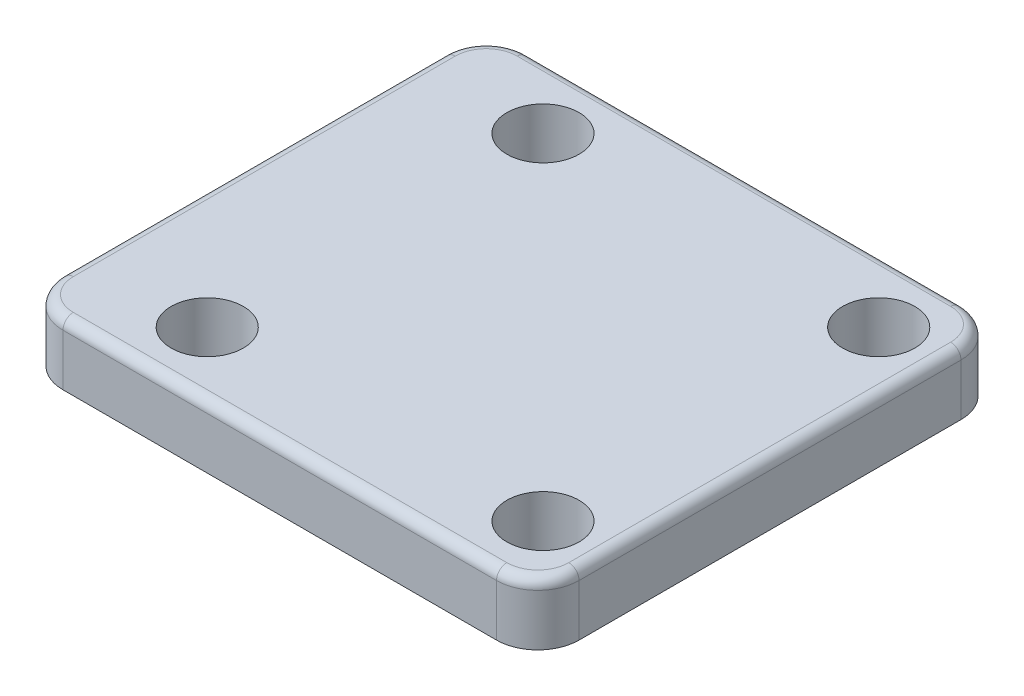
ISO-10303-21;
HEADER;
FILE_DESCRIPTION(('STEP AP214'),'2;1');
FILE_NAME('part.step','',(''),(''),'','','');
FILE_SCHEMA(('AUTOMOTIVE_DESIGN { 1 0 10303 214 1 1 1 1 }'));
ENDSEC;
DATA;
#1=APPLICATION_CONTEXT('core data for automotive mechanical design processes');
#2=APPLICATION_PROTOCOL_DEFINITION('international standard','automotive_design',2000,#1);
#3=PRODUCT_CONTEXT('',#1,'mechanical');
#4=PRODUCT('Part','Part','',(#3));
#5=PRODUCT_RELATED_PRODUCT_CATEGORY('part','',(#4));
#6=PRODUCT_DEFINITION_FORMATION('','',#4);
#7=PRODUCT_DEFINITION_CONTEXT('part definition',#1,'design');
#8=PRODUCT_DEFINITION('design','',#6,#7);
#9=PRODUCT_DEFINITION_SHAPE('','',#8);
#10=(LENGTH_UNIT() NAMED_UNIT(*) SI_UNIT(.MILLI.,.METRE.));
#11=(NAMED_UNIT(*) PLANE_ANGLE_UNIT() SI_UNIT($,.RADIAN.));
#12=(NAMED_UNIT(*) SI_UNIT($,.STERADIAN.) SOLID_ANGLE_UNIT());
#13=UNCERTAINTY_MEASURE_WITH_UNIT(LENGTH_MEASURE(1.E-05),#10,'distance_accuracy_value','');
#14=(GEOMETRIC_REPRESENTATION_CONTEXT(3) GLOBAL_UNCERTAINTY_ASSIGNED_CONTEXT((#13)) GLOBAL_UNIT_ASSIGNED_CONTEXT((#10,
#11,#12)) REPRESENTATION_CONTEXT('',''));
#15=CARTESIAN_POINT('',(0.,0.,0.));
#16=DIRECTION('',(0.,0.,1.));
#17=DIRECTION('',(1.,0.,0.));
#18=AXIS2_PLACEMENT_3D('',#15,#16,#17);
#19=CARTESIAN_POINT('',(-24.,6.,18.5));
#20=DIRECTION('',(0.,-1.,0.));
#21=DIRECTION('',(0.,0.,-1.));
#22=AXIS2_PLACEMENT_3D('',#19,#20,#21);
#23=CYLINDRICAL_SURFACE('',#22,4.);
#24=DIRECTION('',(0.,-1.,0.));
#25=VECTOR('',#24,1.);
#26=CARTESIAN_POINT('',(-24.,6.,22.5));
#27=LINE('',#26,#25);
#28=CARTESIAN_POINT('',(-24.,5.,22.5));
#29=VERTEX_POINT('',#28);
#30=CARTESIAN_POINT('',(-24.,0.,22.5));
#31=VERTEX_POINT('',#30);
#32=EDGE_CURVE('E136',#29,#31,#27,.T.);
#33=ORIENTED_EDGE('',*,*,#32,.F.);
#34=CARTESIAN_POINT('',(-24.,5.,18.5));
#35=DIRECTION('',(0.,-1.,0.));
#36=DIRECTION('',(0.,0.,-1.));
#37=AXIS2_PLACEMENT_3D('',#34,#35,#36);
#38=CIRCLE('',#37,4.);
#39=CARTESIAN_POINT('',(-28.,5.,18.5));
#40=VERTEX_POINT('',#39);
#41=EDGE_CURVE('E252',#29,#40,#38,.T.);
#42=ORIENTED_EDGE('',*,*,#41,.T.);
#43=DIRECTION('',(0.,-1.,0.));
#44=VECTOR('',#43,1.);
#45=CARTESIAN_POINT('',(-28.,6.,18.5));
#46=LINE('',#45,#44);
#47=CARTESIAN_POINT('',(-28.,0.,18.5));
#48=VERTEX_POINT('',#47);
#49=EDGE_CURVE('E159',#40,#48,#46,.T.);
#50=ORIENTED_EDGE('',*,*,#49,.T.);
#51=CARTESIAN_POINT('',(-24.,0.,18.5));
#52=DIRECTION('',(0.,1.,0.));
#53=DIRECTION('',(0.,0.,-1.));
#54=AXIS2_PLACEMENT_3D('',#51,#52,#53);
#55=CIRCLE('',#54,4.);
#56=EDGE_CURVE('E152',#48,#31,#55,.T.);
#57=ORIENTED_EDGE('',*,*,#56,.T.);
#58=EDGE_LOOP('',(#33,#42,#50,#57));
#59=FACE_BOUND('',#58,.T.);
#60=ADVANCED_FACE('F46',(#59),#23,.T.);
#61=CARTESIAN_POINT('',(18.,6.,22.5));
#62=DIRECTION('',(0.,0.,-1.));
#63=DIRECTION('',(-1.,0.,0.));
#64=AXIS2_PLACEMENT_3D('',#61,#62,#63);
#65=PLANE('',#64);
#66=DIRECTION('',(0.,-1.,0.));
#67=VECTOR('',#66,1.);
#68=CARTESIAN_POINT('',(18.,6.,22.5));
#69=LINE('',#68,#67);
#70=CARTESIAN_POINT('',(18.,5.,22.5));
#71=VERTEX_POINT('',#70);
#72=CARTESIAN_POINT('',(18.,0.,22.5));
#73=VERTEX_POINT('',#72);
#74=EDGE_CURVE('E146',#71,#73,#69,.T.);
#75=ORIENTED_EDGE('',*,*,#74,.F.);
#76=DIRECTION('',(1.,0.,0.));
#77=VECTOR('',#76,1.);
#78=CARTESIAN_POINT('',(18.,5.,22.5));
#79=LINE('',#78,#77);
#80=EDGE_CURVE('E63',#71,#29,#79,.F.);
#81=ORIENTED_EDGE('',*,*,#80,.T.);
#82=ORIENTED_EDGE('',*,*,#32,.T.);
#83=DIRECTION('',(1.,0.,0.));
#84=VECTOR('',#83,1.);
#85=CARTESIAN_POINT('',(18.,0.,22.5));
#86=LINE('',#85,#84);
#87=EDGE_CURVE('E139',#31,#73,#86,.T.);
#88=ORIENTED_EDGE('',*,*,#87,.T.);
#89=EDGE_LOOP('',(#75,#81,#82,#88));
#90=FACE_BOUND('',#89,.T.);
#91=ADVANCED_FACE('F138',(#90),#65,.F.);
#92=CARTESIAN_POINT('',(18.,6.,18.5));
#93=DIRECTION('',(0.,-1.,0.));
#94=DIRECTION('',(0.,0.,-1.));
#95=AXIS2_PLACEMENT_3D('',#92,#93,#94);
#96=CYLINDRICAL_SURFACE('',#95,4.);
#97=DIRECTION('',(0.,-1.,0.));
#98=VECTOR('',#97,1.);
#99=CARTESIAN_POINT('',(22.,6.,18.5));
#100=LINE('',#99,#98);
#101=CARTESIAN_POINT('',(22.,5.,18.5));
#102=VERTEX_POINT('',#101);
#103=CARTESIAN_POINT('',(22.,0.,18.5));
#104=VERTEX_POINT('',#103);
#105=EDGE_CURVE('E205',#102,#104,#100,.T.);
#106=ORIENTED_EDGE('',*,*,#105,.F.);
#107=CARTESIAN_POINT('',(18.,5.,18.5));
#108=DIRECTION('',(0.,-1.,0.));
#109=DIRECTION('',(0.,0.,-1.));
#110=AXIS2_PLACEMENT_3D('',#107,#108,#109);
#111=CIRCLE('',#110,4.);
#112=EDGE_CURVE('E71',#102,#71,#111,.T.);
#113=ORIENTED_EDGE('',*,*,#112,.T.);
#114=ORIENTED_EDGE('',*,*,#74,.T.);
#115=CARTESIAN_POINT('',(18.,0.,18.5));
#116=DIRECTION('',(0.,1.,0.));
#117=DIRECTION('',(0.,0.,-1.));
#118=AXIS2_PLACEMENT_3D('',#115,#116,#117);
#119=CIRCLE('',#118,4.);
#120=EDGE_CURVE('E155',#73,#104,#119,.T.);
#121=ORIENTED_EDGE('',*,*,#120,.T.);
#122=EDGE_LOOP('',(#106,#113,#114,#121));
#123=FACE_BOUND('',#122,.T.);
#124=ADVANCED_FACE('F307',(#123),#96,.T.);
#125=CARTESIAN_POINT('',(22.,6.,-18.5));
#126=DIRECTION('',(-1.,0.,0.));
#127=DIRECTION('',(0.,0.,1.));
#128=AXIS2_PLACEMENT_3D('',#125,#126,#127);
#129=PLANE('',#128);
#130=DIRECTION('',(0.,-1.,0.));
#131=VECTOR('',#130,1.);
#132=CARTESIAN_POINT('',(22.,6.,-18.5));
#133=LINE('',#132,#131);
#134=CARTESIAN_POINT('',(22.,5.,-18.5));
#135=VERTEX_POINT('',#134);
#136=CARTESIAN_POINT('',(22.,0.,-18.5));
#137=VERTEX_POINT('',#136);
#138=EDGE_CURVE('E202',#135,#137,#133,.T.);
#139=ORIENTED_EDGE('',*,*,#138,.F.);
#140=DIRECTION('',(0.,0.,-1.));
#141=VECTOR('',#140,1.);
#142=CARTESIAN_POINT('',(22.,5.,-18.5));
#143=LINE('',#142,#141);
#144=EDGE_CURVE('E247',#135,#102,#143,.F.);
#145=ORIENTED_EDGE('',*,*,#144,.T.);
#146=ORIENTED_EDGE('',*,*,#105,.T.);
#147=DIRECTION('',(0.,0.,-1.));
#148=VECTOR('',#147,1.);
#149=CARTESIAN_POINT('',(22.,0.,-18.5));
#150=LINE('',#149,#148);
#151=EDGE_CURVE('E172',#104,#137,#150,.T.);
#152=ORIENTED_EDGE('',*,*,#151,.T.);
#153=EDGE_LOOP('',(#139,#145,#146,#152));
#154=FACE_BOUND('',#153,.T.);
#155=ADVANCED_FACE('F384',(#154),#129,.F.);
#156=CARTESIAN_POINT('',(18.,6.,-18.5));
#157=DIRECTION('',(0.,-1.,0.));
#158=DIRECTION('',(0.,0.,-1.));
#159=AXIS2_PLACEMENT_3D('',#156,#157,#158);
#160=CYLINDRICAL_SURFACE('',#159,4.);
#161=DIRECTION('',(0.,-1.,0.));
#162=VECTOR('',#161,1.);
#163=CARTESIAN_POINT('',(18.,6.,-22.5));
#164=LINE('',#163,#162);
#165=CARTESIAN_POINT('',(18.,5.,-22.5));
#166=VERTEX_POINT('',#165);
#167=CARTESIAN_POINT('',(18.,0.,-22.5));
#168=VERTEX_POINT('',#167);
#169=EDGE_CURVE('E199',#166,#168,#164,.T.);
#170=ORIENTED_EDGE('',*,*,#169,.F.);
#171=CARTESIAN_POINT('',(18.,5.,-18.5));
#172=DIRECTION('',(0.,-1.,0.));
#173=DIRECTION('',(0.,0.,-1.));
#174=AXIS2_PLACEMENT_3D('',#171,#172,#173);
#175=CIRCLE('',#174,4.);
#176=EDGE_CURVE('E244',#166,#135,#175,.T.);
#177=ORIENTED_EDGE('',*,*,#176,.T.);
#178=ORIENTED_EDGE('',*,*,#138,.T.);
#179=CARTESIAN_POINT('',(18.,0.,-18.5));
#180=DIRECTION('',(0.,1.,0.));
#181=DIRECTION('',(0.,0.,-1.));
#182=AXIS2_PLACEMENT_3D('',#179,#180,#181);
#183=CIRCLE('',#182,4.);
#184=EDGE_CURVE('E176',#137,#168,#183,.T.);
#185=ORIENTED_EDGE('',*,*,#184,.T.);
#186=EDGE_LOOP('',(#170,#177,#178,#185));
#187=FACE_BOUND('',#186,.T.);
#188=ADVANCED_FACE('F382',(#187),#160,.T.);
#189=CARTESIAN_POINT('',(18.,6.,-22.5));
#190=DIRECTION('',(0.,0.,1.));
#191=DIRECTION('',(1.,0.,0.));
#192=AXIS2_PLACEMENT_3D('',#189,#190,#191);
#193=PLANE('',#192);
#194=DIRECTION('',(0.,-1.,0.));
#195=VECTOR('',#194,1.);
#196=CARTESIAN_POINT('',(-24.,6.,-22.5));
#197=LINE('',#196,#195);
#198=CARTESIAN_POINT('',(-24.,5.,-22.5));
#199=VERTEX_POINT('',#198);
#200=CARTESIAN_POINT('',(-24.,0.,-22.5));
#201=VERTEX_POINT('',#200);
#202=EDGE_CURVE('E196',#199,#201,#197,.T.);
#203=ORIENTED_EDGE('',*,*,#202,.F.);
#204=DIRECTION('',(-1.,0.,0.));
#205=VECTOR('',#204,1.);
#206=CARTESIAN_POINT('',(18.,5.,-22.5));
#207=LINE('',#206,#205);
#208=EDGE_CURVE('E241',#199,#166,#207,.F.);
#209=ORIENTED_EDGE('',*,*,#208,.T.);
#210=ORIENTED_EDGE('',*,*,#169,.T.);
#211=DIRECTION('',(-1.,0.,0.));
#212=VECTOR('',#211,1.);
#213=CARTESIAN_POINT('',(18.,0.,-22.5));
#214=LINE('',#213,#212);
#215=EDGE_CURVE('E180',#168,#201,#214,.T.);
#216=ORIENTED_EDGE('',*,*,#215,.T.);
#217=EDGE_LOOP('',(#203,#209,#210,#216));
#218=FACE_BOUND('',#217,.T.);
#219=ADVANCED_FACE('F372',(#218),#193,.F.);
#220=CARTESIAN_POINT('',(-24.,6.,-18.5));
#221=DIRECTION('',(0.,-1.,0.));
#222=DIRECTION('',(0.,0.,-1.));
#223=AXIS2_PLACEMENT_3D('',#220,#221,#222);
#224=CYLINDRICAL_SURFACE('',#223,4.);
#225=DIRECTION('',(0.,-1.,0.));
#226=VECTOR('',#225,1.);
#227=CARTESIAN_POINT('',(-28.,6.,-18.5));
#228=LINE('',#227,#226);
#229=CARTESIAN_POINT('',(-28.,5.,-18.5));
#230=VERTEX_POINT('',#229);
#231=CARTESIAN_POINT('',(-28.,0.,-18.5));
#232=VERTEX_POINT('',#231);
#233=EDGE_CURVE('E193',#230,#232,#228,.T.);
#234=ORIENTED_EDGE('',*,*,#233,.F.);
#235=CARTESIAN_POINT('',(-24.,5.,-18.5));
#236=DIRECTION('',(0.,-1.,0.));
#237=DIRECTION('',(0.,0.,-1.));
#238=AXIS2_PLACEMENT_3D('',#235,#236,#237);
#239=CIRCLE('',#238,4.);
#240=EDGE_CURVE('E238',#230,#199,#239,.T.);
#241=ORIENTED_EDGE('',*,*,#240,.T.);
#242=ORIENTED_EDGE('',*,*,#202,.T.);
#243=CARTESIAN_POINT('',(-24.,0.,-18.5));
#244=DIRECTION('',(0.,1.,0.));
#245=DIRECTION('',(0.,0.,1.));
#246=AXIS2_PLACEMENT_3D('',#243,#244,#245);
#247=CIRCLE('',#246,4.);
#248=EDGE_CURVE('E184',#201,#232,#247,.T.);
#249=ORIENTED_EDGE('',*,*,#248,.T.);
#250=EDGE_LOOP('',(#234,#241,#242,#249));
#251=FACE_BOUND('',#250,.T.);
#252=ADVANCED_FACE('F369',(#251),#224,.T.);
#253=CARTESIAN_POINT('',(-28.,6.,-18.5));
#254=DIRECTION('',(1.,0.,0.));
#255=DIRECTION('',(0.,0.,-1.));
#256=AXIS2_PLACEMENT_3D('',#253,#254,#255);
#257=PLANE('',#256);
#258=ORIENTED_EDGE('',*,*,#49,.F.);
#259=DIRECTION('',(0.,0.,1.));
#260=VECTOR('',#259,1.);
#261=CARTESIAN_POINT('',(-28.,5.,-18.5));
#262=LINE('',#261,#260);
#263=EDGE_CURVE('E234',#40,#230,#262,.F.);
#264=ORIENTED_EDGE('',*,*,#263,.T.);
#265=ORIENTED_EDGE('',*,*,#233,.T.);
#266=DIRECTION('',(0.,0.,1.));
#267=VECTOR('',#266,1.);
#268=CARTESIAN_POINT('',(-28.,0.,-18.5));
#269=LINE('',#268,#267);
#270=EDGE_CURVE('E188',#232,#48,#269,.T.);
#271=ORIENTED_EDGE('',*,*,#270,.T.);
#272=EDGE_LOOP('',(#258,#264,#265,#271));
#273=FACE_BOUND('',#272,.T.);
#274=ADVANCED_FACE('F360',(#273),#257,.F.);
#275=CARTESIAN_POINT('',(-24.,6.,18.5));
#276=DIRECTION('',(0.,-1.,0.));
#277=DIRECTION('',(0.,0.,-1.));
#278=AXIS2_PLACEMENT_3D('',#275,#276,#277);
#279=PLANE('',#278);
#280=CARTESIAN_POINT('',(-24.,6.,-18.5));
#281=DIRECTION('',(0.,-1.,0.));
#282=DIRECTION('',(0.,0.,-1.));
#283=AXIS2_PLACEMENT_3D('',#280,#281,#282);
#284=CIRCLE('',#283,3.);
#285=CARTESIAN_POINT('',(-24.,6.,-21.5));
#286=VERTEX_POINT('',#285);
#287=CARTESIAN_POINT('',(-27.,6.,-18.5));
#288=VERTEX_POINT('',#287);
#289=EDGE_CURVE('E227',#286,#288,#284,.F.);
#290=ORIENTED_EDGE('',*,*,#289,.T.);
#291=DIRECTION('',(0.,0.,1.));
#292=VECTOR('',#291,1.);
#293=CARTESIAN_POINT('',(-27.,6.,18.5));
#294=LINE('',#293,#292);
#295=CARTESIAN_POINT('',(-27.,6.,18.5));
#296=VERTEX_POINT('',#295);
#297=EDGE_CURVE('E230',#288,#296,#294,.T.);
#298=ORIENTED_EDGE('',*,*,#297,.T.);
#299=CARTESIAN_POINT('',(-24.,6.,18.5));
#300=DIRECTION('',(0.,-1.,0.));
#301=DIRECTION('',(0.,0.,-1.));
#302=AXIS2_PLACEMENT_3D('',#299,#300,#301);
#303=CIRCLE('',#302,3.);
#304=CARTESIAN_POINT('',(-24.,6.,21.5));
#305=VERTEX_POINT('',#304);
#306=EDGE_CURVE('E212',#296,#305,#303,.F.);
#307=ORIENTED_EDGE('',*,*,#306,.T.);
#308=DIRECTION('',(1.,0.,0.));
#309=VECTOR('',#308,1.);
#310=CARTESIAN_POINT('',(-24.,6.,21.5));
#311=LINE('',#310,#309);
#312=CARTESIAN_POINT('',(18.,6.,21.5));
#313=VERTEX_POINT('',#312);
#314=EDGE_CURVE('E145',#305,#313,#311,.T.);
#315=ORIENTED_EDGE('',*,*,#314,.T.);
#316=CARTESIAN_POINT('',(18.,6.,18.5));
#317=DIRECTION('',(0.,-1.,0.));
#318=DIRECTION('',(0.,0.,-1.));
#319=AXIS2_PLACEMENT_3D('',#316,#317,#318);
#320=CIRCLE('',#319,3.);
#321=CARTESIAN_POINT('',(21.,6.,18.5));
#322=VERTEX_POINT('',#321);
#323=EDGE_CURVE('E215',#313,#322,#320,.F.);
#324=ORIENTED_EDGE('',*,*,#323,.T.);
#325=DIRECTION('',(0.,0.,-1.));
#326=VECTOR('',#325,1.);
#327=CARTESIAN_POINT('',(21.,6.,18.5));
#328=LINE('',#327,#326);
#329=CARTESIAN_POINT('',(21.,6.,-18.5));
#330=VERTEX_POINT('',#329);
#331=EDGE_CURVE('E218',#322,#330,#328,.T.);
#332=ORIENTED_EDGE('',*,*,#331,.T.);
#333=CARTESIAN_POINT('',(18.,6.,-18.5));
#334=DIRECTION('',(0.,-1.,0.));
#335=DIRECTION('',(0.,0.,-1.));
#336=AXIS2_PLACEMENT_3D('',#333,#334,#335);
#337=CIRCLE('',#336,3.);
#338=CARTESIAN_POINT('',(18.,6.,-21.5));
#339=VERTEX_POINT('',#338);
#340=EDGE_CURVE('E221',#330,#339,#337,.F.);
#341=ORIENTED_EDGE('',*,*,#340,.T.);
#342=DIRECTION('',(-1.,0.,0.));
#343=VECTOR('',#342,1.);
#344=CARTESIAN_POINT('',(-24.,6.,-21.5));
#345=LINE('',#344,#343);
#346=EDGE_CURVE('E224',#339,#286,#345,.T.);
#347=ORIENTED_EDGE('',*,*,#346,.T.);
#348=EDGE_LOOP('',(#290,#298,#307,#315,#324,#332,#341,#347));
#349=FACE_BOUND('',#348,.T.);
#350=CARTESIAN_POINT('',(-16.2634559672906,6.,-16.2634559672897));
#351=DIRECTION('',(0.,1.,0.));
#352=DIRECTION('',(0.,0.,1.));
#353=AXIS2_PLACEMENT_3D('',#350,#351,#352);
#354=CIRCLE('',#353,3.50000000000097);
#355=CARTESIAN_POINT('',(-16.2634559672906,6.,-12.7634559672887));
#356=VERTEX_POINT('',#355);
#357=EDGE_CURVE('E436',#356,#356,#354,.T.);
#358=ORIENTED_EDGE('',*,*,#357,.F.);
#359=EDGE_LOOP('',(#358));
#360=FACE_BOUND('',#359,.T.);
#361=CARTESIAN_POINT('',(16.2634559672915,6.,16.2634559672906));
#362=DIRECTION('',(0.,1.,0.));
#363=DIRECTION('',(0.,0.,1.));
#364=AXIS2_PLACEMENT_3D('',#361,#362,#363);
#365=CIRCLE('',#364,3.49999999999977);
#366=CARTESIAN_POINT('',(16.2634559672915,6.,19.7634559672903));
#367=VERTEX_POINT('',#366);
#368=EDGE_CURVE('E444',#367,#367,#365,.T.);
#369=ORIENTED_EDGE('',*,*,#368,.F.);
#370=EDGE_LOOP('',(#369));
#371=FACE_BOUND('',#370,.T.);
#372=CARTESIAN_POINT('',(16.2634559672906,6.,-16.2634559672906));
#373=DIRECTION('',(0.,1.,0.));
#374=DIRECTION('',(0.,0.,1.));
#375=AXIS2_PLACEMENT_3D('',#372,#373,#374);
#376=CIRCLE('',#375,3.5);
#377=CARTESIAN_POINT('',(16.2634559672906,6.,-12.7634559672906));
#378=VERTEX_POINT('',#377);
#379=EDGE_CURVE('E428',#378,#378,#376,.T.);
#380=ORIENTED_EDGE('',*,*,#379,.F.);
#381=EDGE_LOOP('',(#380));
#382=FACE_BOUND('',#381,.T.);
#383=CARTESIAN_POINT('',(-16.2634559672897,6.,16.2634559672915));
#384=DIRECTION('',(0.,1.,0.));
#385=DIRECTION('',(0.,0.,1.));
#386=AXIS2_PLACEMENT_3D('',#383,#384,#385);
#387=CIRCLE('',#386,3.50000000000067);
#388=CARTESIAN_POINT('',(-16.2634559672897,6.,19.7634559672922));
#389=VERTEX_POINT('',#388);
#390=EDGE_CURVE('E166',#389,#389,#387,.T.);
#391=ORIENTED_EDGE('',*,*,#390,.F.);
#392=EDGE_LOOP('',(#391));
#393=FACE_BOUND('',#392,.T.);
#394=ADVANCED_FACE('F400',(#349,#360,#371,#382,#393),#279,.F.);
#395=CARTESIAN_POINT('',(-24.,0.,18.5));
#396=DIRECTION('',(0.,-1.,0.));
#397=DIRECTION('',(0.,0.,-1.));
#398=AXIS2_PLACEMENT_3D('',#395,#396,#397);
#399=PLANE('',#398);
#400=CARTESIAN_POINT('',(0.,0.,0.));
#401=DIRECTION('',(0.,-1.,0.));
#402=DIRECTION('',(0.,0.,-1.));
#403=AXIS2_PLACEMENT_3D('',#400,#401,#402);
#404=CIRCLE('',#403,16.);
#405=CARTESIAN_POINT('',(0.,0.,-16.));
#406=VERTEX_POINT('',#405);
#407=EDGE_CURVE('E261',#406,#406,#404,.T.);
#408=ORIENTED_EDGE('',*,*,#407,.F.);
#409=EDGE_LOOP('',(#408));
#410=FACE_BOUND('',#409,.T.);
#411=CARTESIAN_POINT('',(-16.2634559672906,0.,-16.2634559672897));
#412=DIRECTION('',(0.,1.,0.));
#413=DIRECTION('',(0.,0.,1.));
#414=AXIS2_PLACEMENT_3D('',#411,#412,#413);
#415=CIRCLE('',#414,3.50000000000097);
#416=CARTESIAN_POINT('',(-16.2634559672906,0.,-12.7634559672887));
#417=VERTEX_POINT('',#416);
#418=EDGE_CURVE('E440',#417,#417,#415,.T.);
#419=ORIENTED_EDGE('',*,*,#418,.T.);
#420=EDGE_LOOP('',(#419));
#421=FACE_BOUND('',#420,.T.);
#422=CARTESIAN_POINT('',(16.2634559672915,0.,16.2634559672906));
#423=DIRECTION('',(0.,1.,0.));
#424=DIRECTION('',(0.,0.,1.));
#425=AXIS2_PLACEMENT_3D('',#422,#423,#424);
#426=CIRCLE('',#425,3.49999999999977);
#427=CARTESIAN_POINT('',(16.2634559672915,0.,19.7634559672903));
#428=VERTEX_POINT('',#427);
#429=EDGE_CURVE('E432',#428,#428,#426,.T.);
#430=ORIENTED_EDGE('',*,*,#429,.T.);
#431=EDGE_LOOP('',(#430));
#432=FACE_BOUND('',#431,.T.);
#433=CARTESIAN_POINT('',(16.2634559672906,0.,-16.2634559672906));
#434=DIRECTION('',(0.,1.,0.));
#435=DIRECTION('',(0.,0.,1.));
#436=AXIS2_PLACEMENT_3D('',#433,#434,#435);
#437=CIRCLE('',#436,3.5);
#438=CARTESIAN_POINT('',(16.2634559672906,0.,-12.7634559672906));
#439=VERTEX_POINT('',#438);
#440=EDGE_CURVE('E287',#439,#439,#437,.T.);
#441=ORIENTED_EDGE('',*,*,#440,.T.);
#442=EDGE_LOOP('',(#441));
#443=FACE_BOUND('',#442,.T.);
#444=CARTESIAN_POINT('',(-16.2634559672897,0.,16.2634559672915));
#445=DIRECTION('',(0.,1.,0.));
#446=DIRECTION('',(0.,0.,1.));
#447=AXIS2_PLACEMENT_3D('',#444,#445,#446);
#448=CIRCLE('',#447,3.50000000000067);
#449=CARTESIAN_POINT('',(-16.2634559672897,0.,19.7634559672922));
#450=VERTEX_POINT('',#449);
#451=EDGE_CURVE('E162',#450,#450,#448,.T.);
#452=ORIENTED_EDGE('',*,*,#451,.T.);
#453=EDGE_LOOP('',(#452));
#454=FACE_BOUND('',#453,.T.);
#455=ORIENTED_EDGE('',*,*,#56,.F.);
#456=ORIENTED_EDGE('',*,*,#270,.F.);
#457=ORIENTED_EDGE('',*,*,#248,.F.);
#458=ORIENTED_EDGE('',*,*,#215,.F.);
#459=ORIENTED_EDGE('',*,*,#184,.F.);
#460=ORIENTED_EDGE('',*,*,#151,.F.);
#461=ORIENTED_EDGE('',*,*,#120,.F.);
#462=ORIENTED_EDGE('',*,*,#87,.F.);
#463=EDGE_LOOP('',(#455,#456,#457,#458,#459,#460,#461,#462));
#464=FACE_BOUND('',#463,.T.);
#465=ADVANCED_FACE('F150',(#410,#421,#432,#443,#454,#464),#399,.T.);
#466=CARTESIAN_POINT('',(-16.2634559672897,0.,16.2634559672915));
#467=DIRECTION('',(0.,1.,0.));
#468=DIRECTION('',(0.,0.,1.));
#469=AXIS2_PLACEMENT_3D('',#466,#467,#468);
#470=CYLINDRICAL_SURFACE('',#469,3.50000000000067);
#471=ORIENTED_EDGE('',*,*,#451,.F.);
#472=EDGE_LOOP('',(#471));
#473=FACE_BOUND('',#472,.T.);
#474=ORIENTED_EDGE('',*,*,#390,.T.);
#475=EDGE_LOOP('',(#474));
#476=FACE_BOUND('',#475,.T.);
#477=ADVANCED_FACE('F403',(#473,#476),#470,.F.);
#478=CARTESIAN_POINT('',(16.2634559672906,0.,-16.2634559672906));
#479=DIRECTION('',(0.,1.,0.));
#480=DIRECTION('',(0.,0.,1.));
#481=AXIS2_PLACEMENT_3D('',#478,#479,#480);
#482=CYLINDRICAL_SURFACE('',#481,3.5);
#483=ORIENTED_EDGE('',*,*,#440,.F.);
#484=EDGE_LOOP('',(#483));
#485=FACE_BOUND('',#484,.T.);
#486=ORIENTED_EDGE('',*,*,#379,.T.);
#487=EDGE_LOOP('',(#486));
#488=FACE_BOUND('',#487,.T.);
#489=ADVANCED_FACE('F410',(#485,#488),#482,.F.);
#490=CARTESIAN_POINT('',(16.2634559672915,0.,16.2634559672906));
#491=DIRECTION('',(0.,1.,0.));
#492=DIRECTION('',(0.,0.,1.));
#493=AXIS2_PLACEMENT_3D('',#490,#491,#492);
#494=CYLINDRICAL_SURFACE('',#493,3.49999999999977);
#495=ORIENTED_EDGE('',*,*,#429,.F.);
#496=EDGE_LOOP('',(#495));
#497=FACE_BOUND('',#496,.T.);
#498=ORIENTED_EDGE('',*,*,#368,.T.);
#499=EDGE_LOOP('',(#498));
#500=FACE_BOUND('',#499,.T.);
#501=ADVANCED_FACE('F345',(#497,#500),#494,.F.);
#502=CARTESIAN_POINT('',(-16.2634559672906,0.,-16.2634559672897));
#503=DIRECTION('',(0.,1.,0.));
#504=DIRECTION('',(0.,0.,1.));
#505=AXIS2_PLACEMENT_3D('',#502,#503,#504);
#506=CYLINDRICAL_SURFACE('',#505,3.50000000000097);
#507=ORIENTED_EDGE('',*,*,#418,.F.);
#508=EDGE_LOOP('',(#507));
#509=FACE_BOUND('',#508,.T.);
#510=ORIENTED_EDGE('',*,*,#357,.T.);
#511=EDGE_LOOP('',(#510));
#512=FACE_BOUND('',#511,.T.);
#513=ADVANCED_FACE('F340',(#509,#512),#506,.F.);
#514=CARTESIAN_POINT('',(21.,5.,18.5));
#515=DIRECTION('',(0.,0.,-1.));
#516=DIRECTION('',(-1.,0.,0.));
#517=AXIS2_PLACEMENT_3D('',#514,#515,#516);
#518=CYLINDRICAL_SURFACE('',#517,1.);
#519=CARTESIAN_POINT('',(21.,5.,18.5));
#520=DIRECTION('',(0.,0.,1.));
#521=DIRECTION('',(1.,0.,0.));
#522=AXIS2_PLACEMENT_3D('',#519,#520,#521);
#523=CIRCLE('',#522,1.);
#524=EDGE_CURVE('E280',#102,#322,#523,.T.);
#525=ORIENTED_EDGE('',*,*,#524,.F.);
#526=ORIENTED_EDGE('',*,*,#144,.F.);
#527=CARTESIAN_POINT('',(21.,5.,-18.5));
#528=DIRECTION('',(0.,0.,-1.));
#529=DIRECTION('',(-1.,0.,0.));
#530=AXIS2_PLACEMENT_3D('',#527,#528,#529);
#531=CIRCLE('',#530,1.);
#532=EDGE_CURVE('E284',#330,#135,#531,.T.);
#533=ORIENTED_EDGE('',*,*,#532,.F.);
#534=ORIENTED_EDGE('',*,*,#331,.F.);
#535=EDGE_LOOP('',(#525,#526,#533,#534));
#536=FACE_BOUND('',#535,.T.);
#537=ADVANCED_FACE('F337',(#536),#518,.T.);
#538=CARTESIAN_POINT('',(18.,5.,-18.5));
#539=DIRECTION('',(0.,-1.,0.));
#540=DIRECTION('',(0.,0.,-1.));
#541=AXIS2_PLACEMENT_3D('',#538,#539,#540);
#542=TOROIDAL_SURFACE('',#541,3.,1.);
#543=ORIENTED_EDGE('',*,*,#532,.T.);
#544=ORIENTED_EDGE('',*,*,#176,.F.);
#545=CARTESIAN_POINT('',(18.,5.,-21.5));
#546=DIRECTION('',(-1.,0.,0.));
#547=DIRECTION('',(0.,0.,1.));
#548=AXIS2_PLACEMENT_3D('',#545,#546,#547);
#549=CIRCLE('',#548,1.);
#550=EDGE_CURVE('E276',#339,#166,#549,.T.);
#551=ORIENTED_EDGE('',*,*,#550,.F.);
#552=ORIENTED_EDGE('',*,*,#340,.F.);
#553=EDGE_LOOP('',(#543,#544,#551,#552));
#554=FACE_BOUND('',#553,.T.);
#555=ADVANCED_FACE('F334',(#554),#542,.T.);
#556=CARTESIAN_POINT('',(18.,5.,18.5));
#557=DIRECTION('',(0.,-1.,0.));
#558=DIRECTION('',(0.,0.,-1.));
#559=AXIS2_PLACEMENT_3D('',#556,#557,#558);
#560=TOROIDAL_SURFACE('',#559,3.,1.);
#561=ORIENTED_EDGE('',*,*,#524,.T.);
#562=ORIENTED_EDGE('',*,*,#323,.F.);
#563=CARTESIAN_POINT('',(18.,5.,21.5));
#564=DIRECTION('',(-1.,0.,0.));
#565=DIRECTION('',(0.,0.,1.));
#566=AXIS2_PLACEMENT_3D('',#563,#564,#565);
#567=CIRCLE('',#566,1.);
#568=EDGE_CURVE('E272',#71,#313,#567,.T.);
#569=ORIENTED_EDGE('',*,*,#568,.F.);
#570=ORIENTED_EDGE('',*,*,#112,.F.);
#571=EDGE_LOOP('',(#561,#562,#569,#570));
#572=FACE_BOUND('',#571,.T.);
#573=ADVANCED_FACE('F330',(#572),#560,.T.);
#574=CARTESIAN_POINT('',(-24.,5.,-21.5));
#575=DIRECTION('',(-1.,0.,0.));
#576=DIRECTION('',(0.,0.,1.));
#577=AXIS2_PLACEMENT_3D('',#574,#575,#576);
#578=CYLINDRICAL_SURFACE('',#577,1.);
#579=ORIENTED_EDGE('',*,*,#550,.T.);
#580=ORIENTED_EDGE('',*,*,#208,.F.);
#581=CARTESIAN_POINT('',(-24.,5.,-21.5));
#582=DIRECTION('',(-1.,0.,0.));
#583=DIRECTION('',(0.,0.,1.));
#584=AXIS2_PLACEMENT_3D('',#581,#582,#583);
#585=CIRCLE('',#584,1.);
#586=EDGE_CURVE('E268',#286,#199,#585,.T.);
#587=ORIENTED_EDGE('',*,*,#586,.F.);
#588=ORIENTED_EDGE('',*,*,#346,.F.);
#589=EDGE_LOOP('',(#579,#580,#587,#588));
#590=FACE_BOUND('',#589,.T.);
#591=ADVANCED_FACE('F326',(#590),#578,.T.);
#592=CARTESIAN_POINT('',(-24.,5.,21.5));
#593=DIRECTION('',(1.,0.,0.));
#594=DIRECTION('',(0.,0.,-1.));
#595=AXIS2_PLACEMENT_3D('',#592,#593,#594);
#596=CYLINDRICAL_SURFACE('',#595,1.);
#597=ORIENTED_EDGE('',*,*,#568,.T.);
#598=ORIENTED_EDGE('',*,*,#314,.F.);
#599=CARTESIAN_POINT('',(-24.,5.,21.5));
#600=DIRECTION('',(-1.,0.,0.));
#601=DIRECTION('',(0.,-1.,0.));
#602=AXIS2_PLACEMENT_3D('',#599,#600,#601);
#603=CIRCLE('',#602,1.);
#604=EDGE_CURVE('E264',#29,#305,#603,.T.);
#605=ORIENTED_EDGE('',*,*,#604,.F.);
#606=ORIENTED_EDGE('',*,*,#80,.F.);
#607=EDGE_LOOP('',(#597,#598,#605,#606));
#608=FACE_BOUND('',#607,.T.);
#609=ADVANCED_FACE('F322',(#608),#596,.T.);
#610=CARTESIAN_POINT('',(-24.,5.,-18.5));
#611=DIRECTION('',(0.,-1.,0.));
#612=DIRECTION('',(0.,0.,-1.));
#613=AXIS2_PLACEMENT_3D('',#610,#611,#612);
#614=TOROIDAL_SURFACE('',#613,3.,1.);
#615=ORIENTED_EDGE('',*,*,#586,.T.);
#616=ORIENTED_EDGE('',*,*,#240,.F.);
#617=CARTESIAN_POINT('',(-27.,5.,-18.5));
#618=DIRECTION('',(0.,0.,1.));
#619=DIRECTION('',(1.,0.,0.));
#620=AXIS2_PLACEMENT_3D('',#617,#618,#619);
#621=CIRCLE('',#620,1.);
#622=EDGE_CURVE('E260',#288,#230,#621,.T.);
#623=ORIENTED_EDGE('',*,*,#622,.F.);
#624=ORIENTED_EDGE('',*,*,#289,.F.);
#625=EDGE_LOOP('',(#615,#616,#623,#624));
#626=FACE_BOUND('',#625,.T.);
#627=ADVANCED_FACE('F318',(#626),#614,.T.);
#628=CARTESIAN_POINT('',(-24.,5.,18.5));
#629=DIRECTION('',(0.,-1.,0.));
#630=DIRECTION('',(0.,0.,-1.));
#631=AXIS2_PLACEMENT_3D('',#628,#629,#630);
#632=TOROIDAL_SURFACE('',#631,3.,1.);
#633=ORIENTED_EDGE('',*,*,#604,.T.);
#634=ORIENTED_EDGE('',*,*,#306,.F.);
#635=CARTESIAN_POINT('',(-27.,5.,18.5));
#636=DIRECTION('',(0.,0.,-1.));
#637=DIRECTION('',(0.,1.,0.));
#638=AXIS2_PLACEMENT_3D('',#635,#636,#637);
#639=CIRCLE('',#638,1.);
#640=EDGE_CURVE('E257',#40,#296,#639,.T.);
#641=ORIENTED_EDGE('',*,*,#640,.F.);
#642=ORIENTED_EDGE('',*,*,#41,.F.);
#643=EDGE_LOOP('',(#633,#634,#641,#642));
#644=FACE_BOUND('',#643,.T.);
#645=ADVANCED_FACE('F314',(#644),#632,.T.);
#646=CARTESIAN_POINT('',(-27.,5.,18.5));
#647=DIRECTION('',(0.,0.,1.));
#648=DIRECTION('',(1.,0.,0.));
#649=AXIS2_PLACEMENT_3D('',#646,#647,#648);
#650=CYLINDRICAL_SURFACE('',#649,1.);
#651=ORIENTED_EDGE('',*,*,#622,.T.);
#652=ORIENTED_EDGE('',*,*,#263,.F.);
#653=ORIENTED_EDGE('',*,*,#640,.T.);
#654=ORIENTED_EDGE('',*,*,#297,.F.);
#655=EDGE_LOOP('',(#651,#652,#653,#654));
#656=FACE_BOUND('',#655,.T.);
#657=ADVANCED_FACE('F311',(#656),#650,.T.);
#658=CARTESIAN_POINT('',(0.,-2.,0.));
#659=DIRECTION('',(0.,1.,0.));
#660=DIRECTION('',(0.,0.,1.));
#661=AXIS2_PLACEMENT_3D('',#658,#659,#660);
#662=CYLINDRICAL_SURFACE('',#661,16.);
#663=CARTESIAN_POINT('',(0.,-0.999999999999999,0.));
#664=DIRECTION('',(0.,-1.,0.));
#665=DIRECTION('',(0.,0.,-1.));
#666=AXIS2_PLACEMENT_3D('',#663,#664,#665);
#667=CIRCLE('',#666,16.);
#668=CARTESIAN_POINT('',(0.,-0.999999999999999,-16.));
#669=VERTEX_POINT('',#668);
#670=EDGE_CURVE('E11',#669,#669,#667,.F.);
#671=ORIENTED_EDGE('',*,*,#670,.T.);
#672=EDGE_LOOP('',(#671));
#673=FACE_BOUND('',#672,.T.);
#674=ORIENTED_EDGE('',*,*,#407,.T.);
#675=EDGE_LOOP('',(#674));
#676=FACE_BOUND('',#675,.T.);
#677=ADVANCED_FACE('F299',(#673,#676),#662,.T.);
#678=CARTESIAN_POINT('',(0.,-2.,0.));
#679=DIRECTION('',(0.,-1.,0.));
#680=DIRECTION('',(0.,0.,-1.));
#681=AXIS2_PLACEMENT_3D('',#678,#679,#680);
#682=PLANE('',#681);
#683=CARTESIAN_POINT('',(0.,-2.,0.));
#684=DIRECTION('',(0.,-1.,0.));
#685=DIRECTION('',(0.,0.,-1.));
#686=AXIS2_PLACEMENT_3D('',#683,#684,#685);
#687=CIRCLE('',#686,15.);
#688=CARTESIAN_POINT('',(0.,-2.,-15.));
#689=VERTEX_POINT('',#688);
#690=EDGE_CURVE('E56',#689,#689,#687,.T.);
#691=ORIENTED_EDGE('',*,*,#690,.T.);
#692=EDGE_LOOP('',(#691));
#693=FACE_BOUND('',#692,.T.);
#694=ADVANCED_FACE('F292',(#693),#682,.T.);
#695=CARTESIAN_POINT('',(0.,-2.,0.));
#696=DIRECTION('',(0.,1.,0.));
#697=DIRECTION('',(0.,0.,1.));
#698=AXIS2_PLACEMENT_3D('',#695,#696,#697);
#699=CONICAL_SURFACE('',#698,15.,0.785398163397445);
#700=ORIENTED_EDGE('',*,*,#670,.F.);
#701=EDGE_LOOP('',(#700));
#702=FACE_BOUND('',#701,.T.);
#703=ORIENTED_EDGE('',*,*,#690,.F.);
#704=EDGE_LOOP('',(#703));
#705=FACE_BOUND('',#704,.T.);
#706=ADVANCED_FACE('F49',(#702,#705),#699,.T.);
#707=CLOSED_SHELL('',(#60,#91,#124,#155,#188,#219,#252,#274,#394,#465,#477,#489,#501,#513,#537,
#555,#573,#591,#609,#627,#645,#657,#677,#694,#706));
#708=MANIFOLD_SOLID_BREP('B2',#707);
#709=ADVANCED_BREP_SHAPE_REPRESENTATION('',(#18,#708),#14);
#710=SHAPE_DEFINITION_REPRESENTATION(#9,#709);
ENDSEC;
END-ISO-10303-21;
